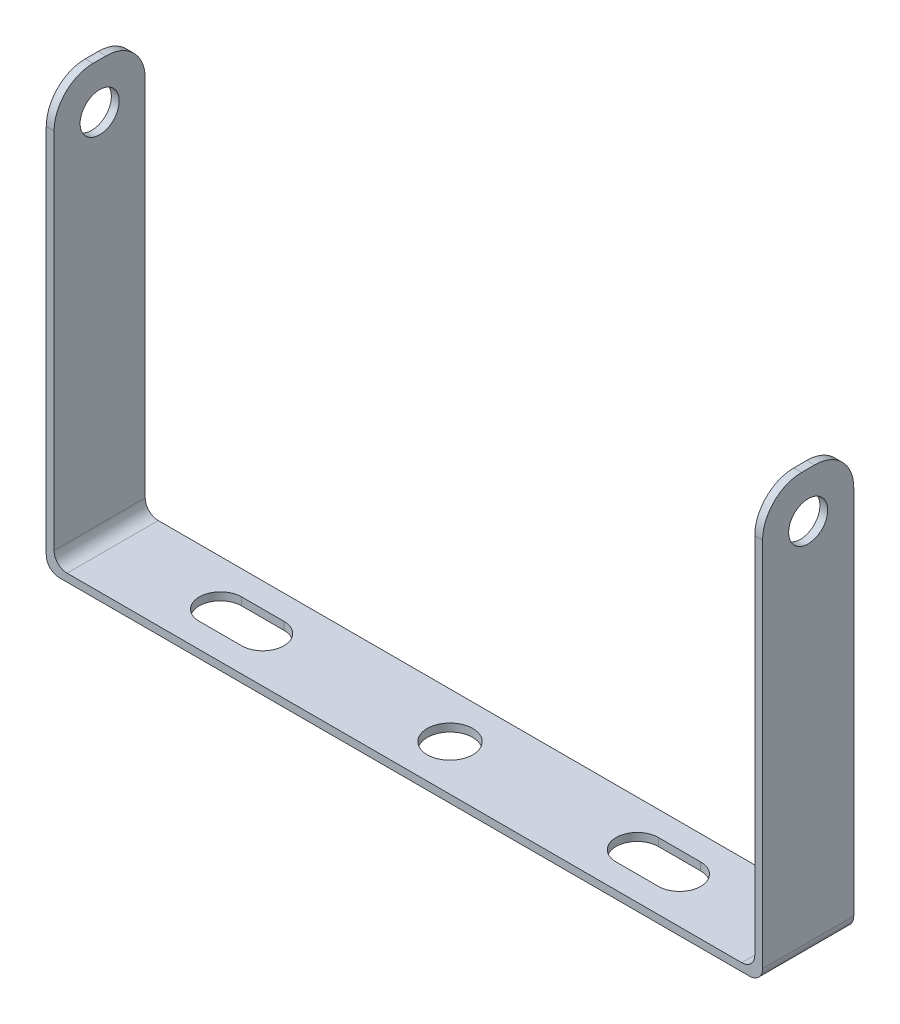
ISO-10303-21;
HEADER;
FILE_DESCRIPTION(('STEP AP214'),'2;1');
FILE_NAME('part.step','',(''),(''),'','','');
FILE_SCHEMA(('AUTOMOTIVE_DESIGN { 1 0 10303 214 1 1 1 1 }'));
ENDSEC;
DATA;
#1=APPLICATION_CONTEXT('core data for automotive mechanical design processes');
#2=APPLICATION_PROTOCOL_DEFINITION('international standard','automotive_design',2000,#1);
#3=PRODUCT_CONTEXT('',#1,'mechanical');
#4=PRODUCT('Part','Part','',(#3));
#5=PRODUCT_RELATED_PRODUCT_CATEGORY('part','',(#4));
#6=PRODUCT_DEFINITION_FORMATION('','',#4);
#7=PRODUCT_DEFINITION_CONTEXT('part definition',#1,'design');
#8=PRODUCT_DEFINITION('design','',#6,#7);
#9=PRODUCT_DEFINITION_SHAPE('','',#8);
#10=(LENGTH_UNIT() NAMED_UNIT(*) SI_UNIT(.MILLI.,.METRE.));
#11=(NAMED_UNIT(*) PLANE_ANGLE_UNIT() SI_UNIT($,.RADIAN.));
#12=(NAMED_UNIT(*) SI_UNIT($,.STERADIAN.) SOLID_ANGLE_UNIT());
#13=UNCERTAINTY_MEASURE_WITH_UNIT(LENGTH_MEASURE(1.E-05),#10,'distance_accuracy_value','');
#14=(GEOMETRIC_REPRESENTATION_CONTEXT(3) GLOBAL_UNCERTAINTY_ASSIGNED_CONTEXT((#13)) GLOBAL_UNIT_ASSIGNED_CONTEXT((#10,
#11,#12)) REPRESENTATION_CONTEXT('',''));
#15=CARTESIAN_POINT('',(0.,0.,0.));
#16=DIRECTION('',(0.,0.,1.));
#17=DIRECTION('',(1.,0.,0.));
#18=AXIS2_PLACEMENT_3D('',#15,#16,#17);
#19=CARTESIAN_POINT('',(0.,0.,14.));
#20=DIRECTION('',(-1.,0.,0.));
#21=DIRECTION('',(0.,0.,1.));
#22=AXIS2_PLACEMENT_3D('',#19,#20,#21);
#23=PLANE('',#22);
#24=CARTESIAN_POINT('',(0.,58.,7.00000000000001));
#25=DIRECTION('',(1.,0.,0.));
#26=DIRECTION('',(0.,0.,-1.));
#27=AXIS2_PLACEMENT_3D('',#24,#25,#26);
#28=CIRCLE('',#27,3.);
#29=CARTESIAN_POINT('',(0.,58.,4.00000000000001));
#30=VERTEX_POINT('',#29);
#31=EDGE_CURVE('E277',#30,#30,#28,.T.);
#32=ORIENTED_EDGE('',*,*,#31,.F.);
#33=EDGE_LOOP('',(#32));
#34=FACE_BOUND('',#33,.T.);
#35=DIRECTION('',(0.,1.,0.));
#36=VECTOR('',#35,1.);
#37=CARTESIAN_POINT('',(0.,0.,0.));
#38=LINE('',#37,#36);
#39=CARTESIAN_POINT('',(0.,2.,0.));
#40=VERTEX_POINT('',#39);
#41=CARTESIAN_POINT('',(0.,59.,0.));
#42=VERTEX_POINT('',#41);
#43=EDGE_CURVE('E289',#40,#42,#38,.T.);
#44=ORIENTED_EDGE('',*,*,#43,.T.);
#45=CARTESIAN_POINT('',(0.,59.,6.));
#46=DIRECTION('',(-1.,0.,0.));
#47=DIRECTION('',(0.,0.,1.));
#48=AXIS2_PLACEMENT_3D('',#45,#46,#47);
#49=CIRCLE('',#48,6.);
#50=CARTESIAN_POINT('',(0.,65.,6.));
#51=VERTEX_POINT('',#50);
#52=EDGE_CURVE('E388',#42,#51,#49,.F.);
#53=ORIENTED_EDGE('',*,*,#52,.T.);
#54=DIRECTION('',(0.,0.,-1.));
#55=VECTOR('',#54,1.);
#56=CARTESIAN_POINT('',(0.,65.,14.));
#57=LINE('',#56,#55);
#58=CARTESIAN_POINT('',(0.,65.,8.));
#59=VERTEX_POINT('',#58);
#60=EDGE_CURVE('E330',#59,#51,#57,.T.);
#61=ORIENTED_EDGE('',*,*,#60,.F.);
#62=CARTESIAN_POINT('',(0.,59.,8.));
#63=DIRECTION('',(-1.,0.,0.));
#64=DIRECTION('',(0.,0.,1.));
#65=AXIS2_PLACEMENT_3D('',#62,#63,#64);
#66=CIRCLE('',#65,6.);
#67=CARTESIAN_POINT('',(0.,59.,14.));
#68=VERTEX_POINT('',#67);
#69=EDGE_CURVE('E386',#59,#68,#66,.F.);
#70=ORIENTED_EDGE('',*,*,#69,.T.);
#71=DIRECTION('',(0.,1.,0.));
#72=VECTOR('',#71,1.);
#73=CARTESIAN_POINT('',(0.,0.,14.));
#74=LINE('',#73,#72);
#75=CARTESIAN_POINT('',(0.,2.,14.));
#76=VERTEX_POINT('',#75);
#77=EDGE_CURVE('E290',#76,#68,#74,.T.);
#78=ORIENTED_EDGE('',*,*,#77,.F.);
#79=DIRECTION('',(0.,0.,-1.));
#80=VECTOR('',#79,1.);
#81=CARTESIAN_POINT('',(0.,2.,14.));
#82=LINE('',#81,#80);
#83=EDGE_CURVE('E341',#76,#40,#82,.T.);
#84=ORIENTED_EDGE('',*,*,#83,.T.);
#85=EDGE_LOOP('',(#44,#53,#61,#70,#78,#84));
#86=FACE_BOUND('',#85,.T.);
#87=ADVANCED_FACE('F42',(#34,#86),#23,.F.);
#88=CARTESIAN_POINT('',(0.,65.,14.));
#89=DIRECTION('',(0.,-1.,0.));
#90=DIRECTION('',(0.,0.,-1.));
#91=AXIS2_PLACEMENT_3D('',#88,#89,#90);
#92=PLANE('',#91);
#93=ORIENTED_EDGE('',*,*,#60,.T.);
#94=DIRECTION('',(-1.,0.,0.));
#95=VECTOR('',#94,1.);
#96=CARTESIAN_POINT('',(0.,65.,6.));
#97=LINE('',#96,#95);
#98=CARTESIAN_POINT('',(-1.2,65.,6.));
#99=VERTEX_POINT('',#98);
#100=EDGE_CURVE('E375',#51,#99,#97,.T.);
#101=ORIENTED_EDGE('',*,*,#100,.T.);
#102=DIRECTION('',(0.,0.,-1.));
#103=VECTOR('',#102,1.);
#104=CARTESIAN_POINT('',(-1.2,65.,14.));
#105=LINE('',#104,#103);
#106=CARTESIAN_POINT('',(-1.2,65.,8.));
#107=VERTEX_POINT('',#106);
#108=EDGE_CURVE('E327',#107,#99,#105,.T.);
#109=ORIENTED_EDGE('',*,*,#108,.F.);
#110=DIRECTION('',(-1.,0.,0.));
#111=VECTOR('',#110,1.);
#112=CARTESIAN_POINT('',(0.,65.,8.));
#113=LINE('',#112,#111);
#114=EDGE_CURVE('E373',#107,#59,#113,.F.);
#115=ORIENTED_EDGE('',*,*,#114,.T.);
#116=EDGE_LOOP('',(#93,#101,#109,#115));
#117=FACE_BOUND('',#116,.T.);
#118=ADVANCED_FACE('F476',(#117),#92,.F.);
#119=CARTESIAN_POINT('',(-1.2,1.2,14.));
#120=DIRECTION('',(1.,0.,0.));
#121=DIRECTION('',(0.,0.,-1.));
#122=AXIS2_PLACEMENT_3D('',#119,#120,#121);
#123=PLANE('',#122);
#124=CARTESIAN_POINT('',(-1.20000000000001,58.,7.00000000000001));
#125=DIRECTION('',(1.,0.,0.));
#126=DIRECTION('',(0.,0.,-1.));
#127=AXIS2_PLACEMENT_3D('',#124,#125,#126);
#128=CIRCLE('',#127,3.);
#129=CARTESIAN_POINT('',(-1.20000000000001,58.,4.00000000000001));
#130=VERTEX_POINT('',#129);
#131=EDGE_CURVE('E286',#130,#130,#128,.T.);
#132=ORIENTED_EDGE('',*,*,#131,.T.);
#133=EDGE_LOOP('',(#132));
#134=FACE_BOUND('',#133,.T.);
#135=ORIENTED_EDGE('',*,*,#108,.T.);
#136=CARTESIAN_POINT('',(-1.2,59.,6.));
#137=DIRECTION('',(1.,0.,0.));
#138=DIRECTION('',(0.,0.,-1.));
#139=AXIS2_PLACEMENT_3D('',#136,#137,#138);
#140=CIRCLE('',#139,6.);
#141=CARTESIAN_POINT('',(-1.2,59.,0.));
#142=VERTEX_POINT('',#141);
#143=EDGE_CURVE('E380',#99,#142,#140,.F.);
#144=ORIENTED_EDGE('',*,*,#143,.T.);
#145=DIRECTION('',(0.,-1.,0.));
#146=VECTOR('',#145,1.);
#147=CARTESIAN_POINT('',(-1.2,1.2,0.));
#148=LINE('',#147,#146);
#149=CARTESIAN_POINT('',(-1.2,3.2,0.));
#150=VERTEX_POINT('',#149);
#151=EDGE_CURVE('E310',#142,#150,#148,.T.);
#152=ORIENTED_EDGE('',*,*,#151,.T.);
#153=DIRECTION('',(0.,0.,-1.));
#154=VECTOR('',#153,1.);
#155=CARTESIAN_POINT('',(-1.2,3.2,14.));
#156=LINE('',#155,#154);
#157=CARTESIAN_POINT('',(-1.2,3.2,14.));
#158=VERTEX_POINT('',#157);
#159=EDGE_CURVE('E338',#150,#158,#156,.F.);
#160=ORIENTED_EDGE('',*,*,#159,.T.);
#161=DIRECTION('',(0.,-1.,0.));
#162=VECTOR('',#161,1.);
#163=CARTESIAN_POINT('',(-1.2,1.2,14.));
#164=LINE('',#163,#162);
#165=CARTESIAN_POINT('',(-1.2,59.,14.));
#166=VERTEX_POINT('',#165);
#167=EDGE_CURVE('E293',#166,#158,#164,.T.);
#168=ORIENTED_EDGE('',*,*,#167,.F.);
#169=CARTESIAN_POINT('',(-1.2,59.,8.));
#170=DIRECTION('',(1.,0.,0.));
#171=DIRECTION('',(0.,0.,-1.));
#172=AXIS2_PLACEMENT_3D('',#169,#170,#171);
#173=CIRCLE('',#172,6.);
#174=EDGE_CURVE('E378',#166,#107,#173,.F.);
#175=ORIENTED_EDGE('',*,*,#174,.T.);
#176=EDGE_LOOP('',(#135,#144,#152,#160,#168,#175));
#177=FACE_BOUND('',#176,.T.);
#178=ADVANCED_FACE('F456',(#134,#177),#123,.F.);
#179=CARTESIAN_POINT('',(-1.2,1.2,14.));
#180=DIRECTION('',(0.,-1.,0.));
#181=DIRECTION('',(0.,0.,-1.));
#182=AXIS2_PLACEMENT_3D('',#179,#180,#181);
#183=PLANE('',#182);
#184=DIRECTION('',(1.,0.,0.));
#185=VECTOR('',#184,1.);
#186=CARTESIAN_POINT('',(-1.2,1.2,3.75));
#187=LINE('',#186,#185);
#188=CARTESIAN_POINT('',(-26.25,1.20000000000001,3.75));
#189=VERTEX_POINT('',#188);
#190=CARTESIAN_POINT('',(-19.75,1.20000000000001,3.75));
#191=VERTEX_POINT('',#190);
#192=EDGE_CURVE('E271',#189,#191,#187,.T.);
#193=ORIENTED_EDGE('',*,*,#192,.T.);
#194=CARTESIAN_POINT('',(-19.75,1.20000000000001,7.));
#195=DIRECTION('',(0.,-1.,0.));
#196=DIRECTION('',(0.,0.,-1.));
#197=AXIS2_PLACEMENT_3D('',#194,#195,#196);
#198=CIRCLE('',#197,3.25);
#199=CARTESIAN_POINT('',(-19.75,1.20000000000001,10.25));
#200=VERTEX_POINT('',#199);
#201=EDGE_CURVE('E274',#191,#200,#198,.T.);
#202=ORIENTED_EDGE('',*,*,#201,.T.);
#203=DIRECTION('',(-1.,0.,0.));
#204=VECTOR('',#203,1.);
#205=CARTESIAN_POINT('',(-1.2,1.2,10.25));
#206=LINE('',#205,#204);
#207=CARTESIAN_POINT('',(-26.25,1.2,10.25));
#208=VERTEX_POINT('',#207);
#209=EDGE_CURVE('E265',#200,#208,#206,.T.);
#210=ORIENTED_EDGE('',*,*,#209,.T.);
#211=CARTESIAN_POINT('',(-26.25,1.20000000000001,7.));
#212=DIRECTION('',(0.,-1.,0.));
#213=DIRECTION('',(0.,0.,-1.));
#214=AXIS2_PLACEMENT_3D('',#211,#212,#213);
#215=CIRCLE('',#214,3.25);
#216=EDGE_CURVE('E268',#208,#189,#215,.T.);
#217=ORIENTED_EDGE('',*,*,#216,.T.);
#218=EDGE_LOOP('',(#193,#202,#210,#217));
#219=FACE_BOUND('',#218,.T.);
#220=DIRECTION('',(-1.,0.,0.));
#221=VECTOR('',#220,1.);
#222=CARTESIAN_POINT('',(-1.2,1.2,10.25));
#223=LINE('',#222,#221);
#224=CARTESIAN_POINT('',(-83.75,1.20000000000001,10.25));
#225=VERTEX_POINT('',#224);
#226=CARTESIAN_POINT('',(-90.25,1.20000000000001,10.25));
#227=VERTEX_POINT('',#226);
#228=EDGE_CURVE('E262',#225,#227,#223,.T.);
#229=ORIENTED_EDGE('',*,*,#228,.T.);
#230=CARTESIAN_POINT('',(-90.25,1.20000000000001,7.));
#231=DIRECTION('',(0.,-1.,0.));
#232=DIRECTION('',(0.,0.,-1.));
#233=AXIS2_PLACEMENT_3D('',#230,#231,#232);
#234=CIRCLE('',#233,3.25);
#235=CARTESIAN_POINT('',(-90.25,1.20000000000001,3.75));
#236=VERTEX_POINT('',#235);
#237=EDGE_CURVE('E209',#227,#236,#234,.T.);
#238=ORIENTED_EDGE('',*,*,#237,.T.);
#239=DIRECTION('',(1.,0.,0.));
#240=VECTOR('',#239,1.);
#241=CARTESIAN_POINT('',(-1.2,1.2,3.75));
#242=LINE('',#241,#240);
#243=CARTESIAN_POINT('',(-83.75,1.2,3.75));
#244=VERTEX_POINT('',#243);
#245=EDGE_CURVE('E256',#236,#244,#242,.T.);
#246=ORIENTED_EDGE('',*,*,#245,.T.);
#247=CARTESIAN_POINT('',(-83.75,1.20000000000001,7.));
#248=DIRECTION('',(0.,-1.,0.));
#249=DIRECTION('',(0.,0.,-1.));
#250=AXIS2_PLACEMENT_3D('',#247,#248,#249);
#251=CIRCLE('',#250,3.25);
#252=EDGE_CURVE('E259',#244,#225,#251,.T.);
#253=ORIENTED_EDGE('',*,*,#252,.T.);
#254=EDGE_LOOP('',(#229,#238,#246,#253));
#255=FACE_BOUND('',#254,.T.);
#256=CARTESIAN_POINT('',(-55.,1.20000000000001,7.));
#257=DIRECTION('',(0.,-1.,0.));
#258=DIRECTION('',(0.,0.,-1.));
#259=AXIS2_PLACEMENT_3D('',#256,#257,#258);
#260=CIRCLE('',#259,3.5);
#261=CARTESIAN_POINT('',(-55.,1.20000000000001,3.5));
#262=VERTEX_POINT('',#261);
#263=EDGE_CURVE('E232',#262,#262,#260,.T.);
#264=ORIENTED_EDGE('',*,*,#263,.T.);
#265=EDGE_LOOP('',(#264));
#266=FACE_BOUND('',#265,.T.);
#267=DIRECTION('',(-1.,0.,0.));
#268=VECTOR('',#267,1.);
#269=CARTESIAN_POINT('',(-1.2,1.2,14.));
#270=LINE('',#269,#268);
#271=CARTESIAN_POINT('',(-3.2,1.2,14.));
#272=VERTEX_POINT('',#271);
#273=CARTESIAN_POINT('',(-106.8,1.2,14.));
#274=VERTEX_POINT('',#273);
#275=EDGE_CURVE('E296',#272,#274,#270,.T.);
#276=ORIENTED_EDGE('',*,*,#275,.F.);
#277=DIRECTION('',(0.,0.,-1.));
#278=VECTOR('',#277,1.);
#279=CARTESIAN_POINT('',(-3.2,1.2,0.));
#280=LINE('',#279,#278);
#281=CARTESIAN_POINT('',(-3.2,1.2,0.));
#282=VERTEX_POINT('',#281);
#283=EDGE_CURVE('E335',#272,#282,#280,.T.);
#284=ORIENTED_EDGE('',*,*,#283,.T.);
#285=DIRECTION('',(-1.,0.,0.));
#286=VECTOR('',#285,1.);
#287=CARTESIAN_POINT('',(-1.2,1.2,0.));
#288=LINE('',#287,#286);
#289=CARTESIAN_POINT('',(-106.8,1.2,0.));
#290=VERTEX_POINT('',#289);
#291=EDGE_CURVE('E312',#282,#290,#288,.T.);
#292=ORIENTED_EDGE('',*,*,#291,.T.);
#293=DIRECTION('',(0.,0.,-1.));
#294=VECTOR('',#293,1.);
#295=CARTESIAN_POINT('',(-106.8,1.2,14.));
#296=LINE('',#295,#294);
#297=EDGE_CURVE('E333',#290,#274,#296,.F.);
#298=ORIENTED_EDGE('',*,*,#297,.T.);
#299=EDGE_LOOP('',(#276,#284,#292,#298));
#300=FACE_BOUND('',#299,.T.);
#301=ADVANCED_FACE('F465',(#219,#255,#266,#300),#183,.F.);
#302=CARTESIAN_POINT('',(-108.8,1.2,14.));
#303=DIRECTION('',(-1.,0.,0.));
#304=DIRECTION('',(0.,0.,1.));
#305=AXIS2_PLACEMENT_3D('',#302,#303,#304);
#306=PLANE('',#305);
#307=CARTESIAN_POINT('',(-108.8,58.,7.00000000000001));
#308=DIRECTION('',(-1.,0.,0.));
#309=DIRECTION('',(0.,0.,1.));
#310=AXIS2_PLACEMENT_3D('',#307,#308,#309);
#311=CIRCLE('',#310,3.);
#312=CARTESIAN_POINT('',(-108.8,58.,10.));
#313=VERTEX_POINT('',#312);
#314=EDGE_CURVE('E281',#313,#313,#311,.T.);
#315=ORIENTED_EDGE('',*,*,#314,.T.);
#316=EDGE_LOOP('',(#315));
#317=FACE_BOUND('',#316,.T.);
#318=DIRECTION('',(0.,1.,0.));
#319=VECTOR('',#318,1.);
#320=CARTESIAN_POINT('',(-108.8,1.2,0.));
#321=LINE('',#320,#319);
#322=CARTESIAN_POINT('',(-108.8,3.2,0.));
#323=VERTEX_POINT('',#322);
#324=CARTESIAN_POINT('',(-108.8,59.,0.));
#325=VERTEX_POINT('',#324);
#326=EDGE_CURVE('E315',#323,#325,#321,.T.);
#327=ORIENTED_EDGE('',*,*,#326,.T.);
#328=CARTESIAN_POINT('',(-108.8,59.,6.));
#329=DIRECTION('',(-1.,0.,0.));
#330=DIRECTION('',(0.,0.,1.));
#331=AXIS2_PLACEMENT_3D('',#328,#329,#330);
#332=CIRCLE('',#331,6.);
#333=CARTESIAN_POINT('',(-108.8,65.,6.));
#334=VERTEX_POINT('',#333);
#335=EDGE_CURVE('E11',#325,#334,#332,.F.);
#336=ORIENTED_EDGE('',*,*,#335,.T.);
#337=DIRECTION('',(0.,0.,-1.));
#338=VECTOR('',#337,1.);
#339=CARTESIAN_POINT('',(-108.8,65.,14.));
#340=LINE('',#339,#338);
#341=CARTESIAN_POINT('',(-108.8,65.,8.));
#342=VERTEX_POINT('',#341);
#343=EDGE_CURVE('E324',#342,#334,#340,.T.);
#344=ORIENTED_EDGE('',*,*,#343,.F.);
#345=CARTESIAN_POINT('',(-108.8,59.,8.));
#346=DIRECTION('',(-1.,0.,0.));
#347=DIRECTION('',(0.,0.,1.));
#348=AXIS2_PLACEMENT_3D('',#345,#346,#347);
#349=CIRCLE('',#348,6.);
#350=CARTESIAN_POINT('',(-108.8,59.,14.));
#351=VERTEX_POINT('',#350);
#352=EDGE_CURVE('E50',#342,#351,#349,.F.);
#353=ORIENTED_EDGE('',*,*,#352,.T.);
#354=DIRECTION('',(0.,1.,0.));
#355=VECTOR('',#354,1.);
#356=CARTESIAN_POINT('',(-108.8,1.2,14.));
#357=LINE('',#356,#355);
#358=CARTESIAN_POINT('',(-108.8,3.2,14.));
#359=VERTEX_POINT('',#358);
#360=EDGE_CURVE('E299',#359,#351,#357,.T.);
#361=ORIENTED_EDGE('',*,*,#360,.F.);
#362=DIRECTION('',(0.,0.,-1.));
#363=VECTOR('',#362,1.);
#364=CARTESIAN_POINT('',(-108.8,3.2,0.));
#365=LINE('',#364,#363);
#366=EDGE_CURVE('E361',#359,#323,#365,.T.);
#367=ORIENTED_EDGE('',*,*,#366,.T.);
#368=EDGE_LOOP('',(#327,#336,#344,#353,#361,#367));
#369=FACE_BOUND('',#368,.T.);
#370=ADVANCED_FACE('F408',(#317,#369),#306,.F.);
#371=CARTESIAN_POINT('',(-110.,65.,14.));
#372=DIRECTION('',(0.,-1.,0.));
#373=DIRECTION('',(0.,0.,-1.));
#374=AXIS2_PLACEMENT_3D('',#371,#372,#373);
#375=PLANE('',#374);
#376=ORIENTED_EDGE('',*,*,#343,.T.);
#377=DIRECTION('',(-1.,0.,0.));
#378=VECTOR('',#377,1.);
#379=CARTESIAN_POINT('',(-110.,65.,6.));
#380=LINE('',#379,#378);
#381=CARTESIAN_POINT('',(-110.,65.,6.));
#382=VERTEX_POINT('',#381);
#383=EDGE_CURVE('E398',#334,#382,#380,.T.);
#384=ORIENTED_EDGE('',*,*,#383,.T.);
#385=DIRECTION('',(0.,0.,-1.));
#386=VECTOR('',#385,1.);
#387=CARTESIAN_POINT('',(-110.,65.,14.));
#388=LINE('',#387,#386);
#389=CARTESIAN_POINT('',(-110.,65.,8.));
#390=VERTEX_POINT('',#389);
#391=EDGE_CURVE('E307',#390,#382,#388,.T.);
#392=ORIENTED_EDGE('',*,*,#391,.F.);
#393=DIRECTION('',(-1.,0.,0.));
#394=VECTOR('',#393,1.);
#395=CARTESIAN_POINT('',(-108.8,65.,8.));
#396=LINE('',#395,#394);
#397=EDGE_CURVE('E396',#390,#342,#396,.F.);
#398=ORIENTED_EDGE('',*,*,#397,.T.);
#399=EDGE_LOOP('',(#376,#384,#392,#398));
#400=FACE_BOUND('',#399,.T.);
#401=ADVANCED_FACE('F421',(#400),#375,.F.);
#402=CARTESIAN_POINT('',(-110.,0.,14.));
#403=DIRECTION('',(1.,0.,0.));
#404=DIRECTION('',(0.,0.,-1.));
#405=AXIS2_PLACEMENT_3D('',#402,#403,#404);
#406=PLANE('',#405);
#407=CARTESIAN_POINT('',(-110.,58.,7.00000000000001));
#408=DIRECTION('',(1.,0.,0.));
#409=DIRECTION('',(0.,0.,-1.));
#410=AXIS2_PLACEMENT_3D('',#407,#408,#409);
#411=CIRCLE('',#410,3.);
#412=CARTESIAN_POINT('',(-110.,58.,4.00000000000001));
#413=VERTEX_POINT('',#412);
#414=EDGE_CURVE('E278',#413,#413,#411,.T.);
#415=ORIENTED_EDGE('',*,*,#414,.T.);
#416=EDGE_LOOP('',(#415));
#417=FACE_BOUND('',#416,.T.);
#418=ORIENTED_EDGE('',*,*,#391,.T.);
#419=CARTESIAN_POINT('',(-110.,59.,6.));
#420=DIRECTION('',(1.,0.,0.));
#421=DIRECTION('',(0.,0.,-1.));
#422=AXIS2_PLACEMENT_3D('',#419,#420,#421);
#423=CIRCLE('',#422,6.);
#424=CARTESIAN_POINT('',(-110.,59.,0.));
#425=VERTEX_POINT('',#424);
#426=EDGE_CURVE('E403',#382,#425,#423,.F.);
#427=ORIENTED_EDGE('',*,*,#426,.T.);
#428=DIRECTION('',(0.,-1.,0.));
#429=VECTOR('',#428,1.);
#430=CARTESIAN_POINT('',(-110.,0.,0.));
#431=LINE('',#430,#429);
#432=CARTESIAN_POINT('',(-110.,2.,0.));
#433=VERTEX_POINT('',#432);
#434=EDGE_CURVE('E318',#425,#433,#431,.T.);
#435=ORIENTED_EDGE('',*,*,#434,.T.);
#436=DIRECTION('',(0.,0.,-1.));
#437=VECTOR('',#436,1.);
#438=CARTESIAN_POINT('',(-110.,2.,14.));
#439=LINE('',#438,#437);
#440=CARTESIAN_POINT('',(-110.,2.,14.));
#441=VERTEX_POINT('',#440);
#442=EDGE_CURVE('E358',#433,#441,#439,.F.);
#443=ORIENTED_EDGE('',*,*,#442,.T.);
#444=DIRECTION('',(0.,-1.,0.));
#445=VECTOR('',#444,1.);
#446=CARTESIAN_POINT('',(-110.,0.,14.));
#447=LINE('',#446,#445);
#448=CARTESIAN_POINT('',(-110.,59.,14.));
#449=VERTEX_POINT('',#448);
#450=EDGE_CURVE('E302',#449,#441,#447,.T.);
#451=ORIENTED_EDGE('',*,*,#450,.F.);
#452=CARTESIAN_POINT('',(-110.,59.,8.));
#453=DIRECTION('',(1.,0.,0.));
#454=DIRECTION('',(0.,0.,-1.));
#455=AXIS2_PLACEMENT_3D('',#452,#453,#454);
#456=CIRCLE('',#455,6.);
#457=EDGE_CURVE('E401',#449,#390,#456,.F.);
#458=ORIENTED_EDGE('',*,*,#457,.T.);
#459=EDGE_LOOP('',(#418,#427,#435,#443,#451,#458));
#460=FACE_BOUND('',#459,.T.);
#461=ADVANCED_FACE('F419',(#417,#460),#406,.F.);
#462=CARTESIAN_POINT('',(0.,0.,14.));
#463=DIRECTION('',(0.,1.,0.));
#464=DIRECTION('',(0.,0.,1.));
#465=AXIS2_PLACEMENT_3D('',#462,#463,#464);
#466=PLANE('',#465);
#467=DIRECTION('',(-1.,0.,0.));
#468=VECTOR('',#467,1.);
#469=CARTESIAN_POINT('',(-19.75,0.,10.25));
#470=LINE('',#469,#468);
#471=CARTESIAN_POINT('',(-19.75,0.,10.25));
#472=VERTEX_POINT('',#471);
#473=CARTESIAN_POINT('',(-26.25,0.,10.25));
#474=VERTEX_POINT('',#473);
#475=EDGE_CURVE('E251',#472,#474,#470,.T.);
#476=ORIENTED_EDGE('',*,*,#475,.F.);
#477=CARTESIAN_POINT('',(-19.75,0.,7.));
#478=DIRECTION('',(0.,-1.,0.));
#479=DIRECTION('',(0.,0.,1.));
#480=AXIS2_PLACEMENT_3D('',#477,#478,#479);
#481=CIRCLE('',#480,3.25);
#482=CARTESIAN_POINT('',(-19.75,0.,3.75));
#483=VERTEX_POINT('',#482);
#484=EDGE_CURVE('E213',#483,#472,#481,.T.);
#485=ORIENTED_EDGE('',*,*,#484,.F.);
#486=DIRECTION('',(1.,0.,0.));
#487=VECTOR('',#486,1.);
#488=CARTESIAN_POINT('',(-19.75,0.,3.75));
#489=LINE('',#488,#487);
#490=CARTESIAN_POINT('',(-26.25,0.,3.75));
#491=VERTEX_POINT('',#490);
#492=EDGE_CURVE('E240',#491,#483,#489,.T.);
#493=ORIENTED_EDGE('',*,*,#492,.F.);
#494=CARTESIAN_POINT('',(-26.25,0.,7.));
#495=DIRECTION('',(0.,-1.,0.));
#496=DIRECTION('',(0.,0.,1.));
#497=AXIS2_PLACEMENT_3D('',#494,#495,#496);
#498=CIRCLE('',#497,3.25);
#499=EDGE_CURVE('E248',#474,#491,#498,.T.);
#500=ORIENTED_EDGE('',*,*,#499,.F.);
#501=EDGE_LOOP('',(#476,#485,#493,#500));
#502=FACE_BOUND('',#501,.T.);
#503=DIRECTION('',(1.,0.,0.));
#504=VECTOR('',#503,1.);
#505=CARTESIAN_POINT('',(-90.25,0.,3.75));
#506=LINE('',#505,#504);
#507=CARTESIAN_POINT('',(-90.25,0.,3.75));
#508=VERTEX_POINT('',#507);
#509=CARTESIAN_POINT('',(-83.75,0.,3.75));
#510=VERTEX_POINT('',#509);
#511=EDGE_CURVE('E228',#508,#510,#506,.T.);
#512=ORIENTED_EDGE('',*,*,#511,.F.);
#513=CARTESIAN_POINT('',(-90.25,0.,7.));
#514=DIRECTION('',(0.,-1.,0.));
#515=DIRECTION('',(0.,0.,-1.));
#516=AXIS2_PLACEMENT_3D('',#513,#514,#515);
#517=CIRCLE('',#516,3.25);
#518=CARTESIAN_POINT('',(-90.25,0.,10.25));
#519=VERTEX_POINT('',#518);
#520=EDGE_CURVE('E206',#519,#508,#517,.T.);
#521=ORIENTED_EDGE('',*,*,#520,.F.);
#522=DIRECTION('',(-1.,0.,0.));
#523=VECTOR('',#522,1.);
#524=CARTESIAN_POINT('',(-90.25,0.,10.25));
#525=LINE('',#524,#523);
#526=CARTESIAN_POINT('',(-83.75,0.,10.25));
#527=VERTEX_POINT('',#526);
#528=EDGE_CURVE('E216',#527,#519,#525,.T.);
#529=ORIENTED_EDGE('',*,*,#528,.F.);
#530=CARTESIAN_POINT('',(-83.75,0.,7.));
#531=DIRECTION('',(0.,-1.,0.));
#532=DIRECTION('',(0.,0.,-1.));
#533=AXIS2_PLACEMENT_3D('',#530,#531,#532);
#534=CIRCLE('',#533,3.25);
#535=EDGE_CURVE('E222',#510,#527,#534,.T.);
#536=ORIENTED_EDGE('',*,*,#535,.F.);
#537=EDGE_LOOP('',(#512,#521,#529,#536));
#538=FACE_BOUND('',#537,.T.);
#539=CARTESIAN_POINT('',(-55.,0.,7.));
#540=DIRECTION('',(0.,-1.,0.));
#541=DIRECTION('',(0.,0.,-1.));
#542=AXIS2_PLACEMENT_3D('',#539,#540,#541);
#543=CIRCLE('',#542,3.5);
#544=CARTESIAN_POINT('',(-55.,0.,3.5));
#545=VERTEX_POINT('',#544);
#546=EDGE_CURVE('E229',#545,#545,#543,.T.);
#547=ORIENTED_EDGE('',*,*,#546,.F.);
#548=EDGE_LOOP('',(#547));
#549=FACE_BOUND('',#548,.T.);
#550=DIRECTION('',(1.,0.,0.));
#551=VECTOR('',#550,1.);
#552=CARTESIAN_POINT('',(0.,0.,0.));
#553=LINE('',#552,#551);
#554=CARTESIAN_POINT('',(-108.,0.,0.));
#555=VERTEX_POINT('',#554);
#556=CARTESIAN_POINT('',(-2.,0.,0.));
#557=VERTEX_POINT('',#556);
#558=EDGE_CURVE('E294',#555,#557,#553,.T.);
#559=ORIENTED_EDGE('',*,*,#558,.T.);
#560=DIRECTION('',(0.,0.,-1.));
#561=VECTOR('',#560,1.);
#562=CARTESIAN_POINT('',(-2.,0.,14.));
#563=LINE('',#562,#561);
#564=CARTESIAN_POINT('',(-2.,0.,14.));
#565=VERTEX_POINT('',#564);
#566=EDGE_CURVE('E352',#557,#565,#563,.F.);
#567=ORIENTED_EDGE('',*,*,#566,.T.);
#568=DIRECTION('',(1.,0.,0.));
#569=VECTOR('',#568,1.);
#570=CARTESIAN_POINT('',(0.,0.,14.));
#571=LINE('',#570,#569);
#572=CARTESIAN_POINT('',(-108.,0.,14.));
#573=VERTEX_POINT('',#572);
#574=EDGE_CURVE('E304',#573,#565,#571,.T.);
#575=ORIENTED_EDGE('',*,*,#574,.F.);
#576=DIRECTION('',(0.,0.,-1.));
#577=VECTOR('',#576,1.);
#578=CARTESIAN_POINT('',(-108.,0.,14.));
#579=LINE('',#578,#577);
#580=EDGE_CURVE('E349',#573,#555,#579,.T.);
#581=ORIENTED_EDGE('',*,*,#580,.T.);
#582=EDGE_LOOP('',(#559,#567,#575,#581));
#583=FACE_BOUND('',#582,.T.);
#584=ADVANCED_FACE('F226',(#502,#538,#549,#583),#466,.F.);
#585=CARTESIAN_POINT('',(0.,0.,14.));
#586=DIRECTION('',(0.,0.,1.));
#587=DIRECTION('',(1.,0.,0.));
#588=AXIS2_PLACEMENT_3D('',#585,#586,#587);
#589=PLANE('',#588);
#590=ORIENTED_EDGE('',*,*,#77,.T.);
#591=DIRECTION('',(-1.,0.,0.));
#592=VECTOR('',#591,1.);
#593=CARTESIAN_POINT('',(-1.2,59.,14.));
#594=LINE('',#593,#592);
#595=EDGE_CURVE('E393',#68,#166,#594,.T.);
#596=ORIENTED_EDGE('',*,*,#595,.T.);
#597=ORIENTED_EDGE('',*,*,#167,.T.);
#598=CARTESIAN_POINT('',(-3.2,3.2,14.));
#599=DIRECTION('',(0.,0.,1.));
#600=DIRECTION('',(1.,0.,0.));
#601=AXIS2_PLACEMENT_3D('',#598,#599,#600);
#602=CIRCLE('',#601,2.);
#603=EDGE_CURVE('E367',#158,#272,#602,.F.);
#604=ORIENTED_EDGE('',*,*,#603,.T.);
#605=ORIENTED_EDGE('',*,*,#275,.T.);
#606=CARTESIAN_POINT('',(-106.8,3.2,14.));
#607=DIRECTION('',(0.,0.,1.));
#608=DIRECTION('',(1.,0.,0.));
#609=AXIS2_PLACEMENT_3D('',#606,#607,#608);
#610=CIRCLE('',#609,2.);
#611=EDGE_CURVE('E371',#274,#359,#610,.F.);
#612=ORIENTED_EDGE('',*,*,#611,.T.);
#613=ORIENTED_EDGE('',*,*,#360,.T.);
#614=DIRECTION('',(-1.,0.,0.));
#615=VECTOR('',#614,1.);
#616=CARTESIAN_POINT('',(-110.,59.,14.));
#617=LINE('',#616,#615);
#618=EDGE_CURVE('E390',#351,#449,#617,.T.);
#619=ORIENTED_EDGE('',*,*,#618,.T.);
#620=ORIENTED_EDGE('',*,*,#450,.T.);
#621=CARTESIAN_POINT('',(-108.,2.,14.));
#622=DIRECTION('',(0.,0.,1.));
#623=DIRECTION('',(1.,0.,0.));
#624=AXIS2_PLACEMENT_3D('',#621,#622,#623);
#625=CIRCLE('',#624,2.);
#626=EDGE_CURVE('E354',#441,#573,#625,.T.);
#627=ORIENTED_EDGE('',*,*,#626,.T.);
#628=ORIENTED_EDGE('',*,*,#574,.T.);
#629=CARTESIAN_POINT('',(-2.,2.,14.));
#630=DIRECTION('',(0.,0.,1.));
#631=DIRECTION('',(1.,0.,0.));
#632=AXIS2_PLACEMENT_3D('',#629,#630,#631);
#633=CIRCLE('',#632,2.);
#634=EDGE_CURVE('E356',#565,#76,#633,.T.);
#635=ORIENTED_EDGE('',*,*,#634,.T.);
#636=EDGE_LOOP('',(#590,#596,#597,#604,#605,#612,#613,#619,#620,#627,#628,#635));
#637=FACE_BOUND('',#636,.T.);
#638=ADVANCED_FACE('F414',(#637),#589,.T.);
#639=CARTESIAN_POINT('',(0.,0.,0.));
#640=DIRECTION('',(0.,0.,1.));
#641=DIRECTION('',(1.,0.,0.));
#642=AXIS2_PLACEMENT_3D('',#639,#640,#641);
#643=PLANE('',#642);
#644=ORIENTED_EDGE('',*,*,#151,.F.);
#645=DIRECTION('',(-1.,0.,0.));
#646=VECTOR('',#645,1.);
#647=CARTESIAN_POINT('',(0.,59.,0.));
#648=LINE('',#647,#646);
#649=EDGE_CURVE('E384',#142,#42,#648,.F.);
#650=ORIENTED_EDGE('',*,*,#649,.T.);
#651=ORIENTED_EDGE('',*,*,#43,.F.);
#652=CARTESIAN_POINT('',(-2.,2.,0.));
#653=DIRECTION('',(0.,0.,1.));
#654=DIRECTION('',(1.,0.,0.));
#655=AXIS2_PLACEMENT_3D('',#652,#653,#654);
#656=CIRCLE('',#655,2.);
#657=EDGE_CURVE('E347',#40,#557,#656,.F.);
#658=ORIENTED_EDGE('',*,*,#657,.T.);
#659=ORIENTED_EDGE('',*,*,#558,.F.);
#660=CARTESIAN_POINT('',(-108.,2.,0.));
#661=DIRECTION('',(0.,0.,1.));
#662=DIRECTION('',(1.,0.,0.));
#663=AXIS2_PLACEMENT_3D('',#660,#661,#662);
#664=CIRCLE('',#663,2.);
#665=EDGE_CURVE('E344',#555,#433,#664,.F.);
#666=ORIENTED_EDGE('',*,*,#665,.T.);
#667=ORIENTED_EDGE('',*,*,#434,.F.);
#668=DIRECTION('',(-1.,0.,0.));
#669=VECTOR('',#668,1.);
#670=CARTESIAN_POINT('',(0.,59.,0.));
#671=LINE('',#670,#669);
#672=EDGE_CURVE('E382',#425,#325,#671,.F.);
#673=ORIENTED_EDGE('',*,*,#672,.T.);
#674=ORIENTED_EDGE('',*,*,#326,.F.);
#675=CARTESIAN_POINT('',(-106.8,3.2,0.));
#676=DIRECTION('',(0.,0.,1.));
#677=DIRECTION('',(1.,0.,0.));
#678=AXIS2_PLACEMENT_3D('',#675,#676,#677);
#679=CIRCLE('',#678,2.);
#680=EDGE_CURVE('E369',#323,#290,#679,.T.);
#681=ORIENTED_EDGE('',*,*,#680,.T.);
#682=ORIENTED_EDGE('',*,*,#291,.F.);
#683=CARTESIAN_POINT('',(-3.2,3.2,0.));
#684=DIRECTION('',(0.,0.,1.));
#685=DIRECTION('',(1.,0.,0.));
#686=AXIS2_PLACEMENT_3D('',#683,#684,#685);
#687=CIRCLE('',#686,2.);
#688=EDGE_CURVE('E364',#282,#150,#687,.T.);
#689=ORIENTED_EDGE('',*,*,#688,.T.);
#690=EDGE_LOOP('',(#644,#650,#651,#658,#659,#666,#667,#673,#674,#681,#682,#689));
#691=FACE_BOUND('',#690,.T.);
#692=ADVANCED_FACE('F430',(#691),#643,.F.);
#693=CARTESIAN_POINT('',(-3.2,3.2,14.));
#694=DIRECTION('',(0.,0.,1.));
#695=DIRECTION('',(1.,0.,0.));
#696=AXIS2_PLACEMENT_3D('',#693,#694,#695);
#697=CYLINDRICAL_SURFACE('',#696,2.);
#698=ORIENTED_EDGE('',*,*,#603,.F.);
#699=ORIENTED_EDGE('',*,*,#159,.F.);
#700=ORIENTED_EDGE('',*,*,#688,.F.);
#701=ORIENTED_EDGE('',*,*,#283,.F.);
#702=EDGE_LOOP('',(#698,#699,#700,#701));
#703=FACE_BOUND('',#702,.T.);
#704=ADVANCED_FACE('F462',(#703),#697,.F.);
#705=CARTESIAN_POINT('',(-2.,2.,14.));
#706=DIRECTION('',(0.,0.,-1.));
#707=DIRECTION('',(-1.,0.,0.));
#708=AXIS2_PLACEMENT_3D('',#705,#706,#707);
#709=CYLINDRICAL_SURFACE('',#708,2.);
#710=ORIENTED_EDGE('',*,*,#634,.F.);
#711=ORIENTED_EDGE('',*,*,#566,.F.);
#712=ORIENTED_EDGE('',*,*,#657,.F.);
#713=ORIENTED_EDGE('',*,*,#83,.F.);
#714=EDGE_LOOP('',(#710,#711,#712,#713));
#715=FACE_BOUND('',#714,.T.);
#716=ADVANCED_FACE('F443',(#715),#709,.T.);
#717=CARTESIAN_POINT('',(-108.,2.,14.));
#718=DIRECTION('',(0.,0.,-1.));
#719=DIRECTION('',(-1.,0.,0.));
#720=AXIS2_PLACEMENT_3D('',#717,#718,#719);
#721=CYLINDRICAL_SURFACE('',#720,2.);
#722=ORIENTED_EDGE('',*,*,#626,.F.);
#723=ORIENTED_EDGE('',*,*,#442,.F.);
#724=ORIENTED_EDGE('',*,*,#665,.F.);
#725=ORIENTED_EDGE('',*,*,#580,.F.);
#726=EDGE_LOOP('',(#722,#723,#724,#725));
#727=FACE_BOUND('',#726,.T.);
#728=ADVANCED_FACE('F437',(#727),#721,.T.);
#729=CARTESIAN_POINT('',(-106.8,3.2,14.));
#730=DIRECTION('',(0.,0.,1.));
#731=DIRECTION('',(1.,0.,0.));
#732=AXIS2_PLACEMENT_3D('',#729,#730,#731);
#733=CYLINDRICAL_SURFACE('',#732,2.);
#734=ORIENTED_EDGE('',*,*,#611,.F.);
#735=ORIENTED_EDGE('',*,*,#297,.F.);
#736=ORIENTED_EDGE('',*,*,#680,.F.);
#737=ORIENTED_EDGE('',*,*,#366,.F.);
#738=EDGE_LOOP('',(#734,#735,#736,#737));
#739=FACE_BOUND('',#738,.T.);
#740=ADVANCED_FACE('F469',(#739),#733,.F.);
#741=CARTESIAN_POINT('',(-110.,58.,7.00000000000001));
#742=DIRECTION('',(1.,0.,0.));
#743=DIRECTION('',(0.,0.,-1.));
#744=AXIS2_PLACEMENT_3D('',#741,#742,#743);
#745=CYLINDRICAL_SURFACE('',#744,3.);
#746=ORIENTED_EDGE('',*,*,#414,.F.);
#747=EDGE_LOOP('',(#746));
#748=FACE_BOUND('',#747,.T.);
#749=ORIENTED_EDGE('',*,*,#314,.F.);
#750=EDGE_LOOP('',(#749));
#751=FACE_BOUND('',#750,.T.);
#752=ADVANCED_FACE('F497',(#748,#751),#745,.F.);
#753=ORIENTED_EDGE('',*,*,#31,.T.);
#754=EDGE_LOOP('',(#753));
#755=FACE_BOUND('',#754,.T.);
#756=ORIENTED_EDGE('',*,*,#131,.F.);
#757=EDGE_LOOP('',(#756));
#758=FACE_BOUND('',#757,.T.);
#759=ADVANCED_FACE('F500',(#755,#758),#745,.F.);
#760=CARTESIAN_POINT('',(0.,59.,6.));
#761=DIRECTION('',(-1.,0.,0.));
#762=DIRECTION('',(0.,0.,1.));
#763=AXIS2_PLACEMENT_3D('',#760,#761,#762);
#764=CYLINDRICAL_SURFACE('',#763,6.);
#765=ORIENTED_EDGE('',*,*,#52,.F.);
#766=ORIENTED_EDGE('',*,*,#649,.F.);
#767=ORIENTED_EDGE('',*,*,#143,.F.);
#768=ORIENTED_EDGE('',*,*,#100,.F.);
#769=EDGE_LOOP('',(#765,#766,#767,#768));
#770=FACE_BOUND('',#769,.T.);
#771=ADVANCED_FACE('F473',(#770),#764,.T.);
#772=CARTESIAN_POINT('',(0.,59.,8.));
#773=DIRECTION('',(1.,0.,0.));
#774=DIRECTION('',(0.,0.,-1.));
#775=AXIS2_PLACEMENT_3D('',#772,#773,#774);
#776=CYLINDRICAL_SURFACE('',#775,6.);
#777=ORIENTED_EDGE('',*,*,#69,.F.);
#778=ORIENTED_EDGE('',*,*,#114,.F.);
#779=ORIENTED_EDGE('',*,*,#174,.F.);
#780=ORIENTED_EDGE('',*,*,#595,.F.);
#781=EDGE_LOOP('',(#777,#778,#779,#780));
#782=FACE_BOUND('',#781,.T.);
#783=ADVANCED_FACE('F453',(#782),#776,.T.);
#784=CARTESIAN_POINT('',(-110.,59.,6.));
#785=DIRECTION('',(-1.,0.,0.));
#786=DIRECTION('',(0.,0.,1.));
#787=AXIS2_PLACEMENT_3D('',#784,#785,#786);
#788=CYLINDRICAL_SURFACE('',#787,6.);
#789=ORIENTED_EDGE('',*,*,#335,.F.);
#790=ORIENTED_EDGE('',*,*,#672,.F.);
#791=ORIENTED_EDGE('',*,*,#426,.F.);
#792=ORIENTED_EDGE('',*,*,#383,.F.);
#793=EDGE_LOOP('',(#789,#790,#791,#792));
#794=FACE_BOUND('',#793,.T.);
#795=ADVANCED_FACE('F425',(#794),#788,.T.);
#796=CARTESIAN_POINT('',(0.,59.,8.));
#797=DIRECTION('',(1.,0.,0.));
#798=DIRECTION('',(0.,0.,-1.));
#799=AXIS2_PLACEMENT_3D('',#796,#797,#798);
#800=CYLINDRICAL_SURFACE('',#799,6.);
#801=ORIENTED_EDGE('',*,*,#352,.F.);
#802=ORIENTED_EDGE('',*,*,#397,.F.);
#803=ORIENTED_EDGE('',*,*,#457,.F.);
#804=ORIENTED_EDGE('',*,*,#618,.F.);
#805=EDGE_LOOP('',(#801,#802,#803,#804));
#806=FACE_BOUND('',#805,.T.);
#807=ADVANCED_FACE('F44',(#806),#800,.T.);
#808=CARTESIAN_POINT('',(-55.,65.,7.));
#809=DIRECTION('',(0.,-1.,0.));
#810=DIRECTION('',(0.,0.,-1.));
#811=AXIS2_PLACEMENT_3D('',#808,#809,#810);
#812=CYLINDRICAL_SURFACE('',#811,3.5);
#813=ORIENTED_EDGE('',*,*,#546,.T.);
#814=EDGE_LOOP('',(#813));
#815=FACE_BOUND('',#814,.T.);
#816=ORIENTED_EDGE('',*,*,#263,.F.);
#817=EDGE_LOOP('',(#816));
#818=FACE_BOUND('',#817,.T.);
#819=ADVANCED_FACE('F506',(#815,#818),#812,.F.);
#820=CARTESIAN_POINT('',(-90.25,65.,7.));
#821=DIRECTION('',(0.,-1.,0.));
#822=DIRECTION('',(0.,0.,-1.));
#823=AXIS2_PLACEMENT_3D('',#820,#821,#822);
#824=CYLINDRICAL_SURFACE('',#823,3.25);
#825=DIRECTION('',(0.,-1.,0.));
#826=VECTOR('',#825,1.);
#827=CARTESIAN_POINT('',(-90.25,65.,10.25));
#828=LINE('',#827,#826);
#829=EDGE_CURVE('E201',#227,#519,#828,.T.);
#830=ORIENTED_EDGE('',*,*,#829,.T.);
#831=ORIENTED_EDGE('',*,*,#520,.T.);
#832=DIRECTION('',(0.,-1.,0.));
#833=VECTOR('',#832,1.);
#834=CARTESIAN_POINT('',(-90.25,65.,3.75));
#835=LINE('',#834,#833);
#836=EDGE_CURVE('E223',#236,#508,#835,.T.);
#837=ORIENTED_EDGE('',*,*,#836,.F.);
#838=ORIENTED_EDGE('',*,*,#237,.F.);
#839=EDGE_LOOP('',(#830,#831,#837,#838));
#840=FACE_BOUND('',#839,.T.);
#841=ADVANCED_FACE('F203',(#840),#824,.F.);
#842=CARTESIAN_POINT('',(-90.25,65.,10.25));
#843=DIRECTION('',(0.,0.,1.));
#844=DIRECTION('',(1.,0.,0.));
#845=AXIS2_PLACEMENT_3D('',#842,#843,#844);
#846=PLANE('',#845);
#847=DIRECTION('',(0.,-1.,0.));
#848=VECTOR('',#847,1.);
#849=CARTESIAN_POINT('',(-83.75,65.,10.25));
#850=LINE('',#849,#848);
#851=EDGE_CURVE('E212',#225,#527,#850,.T.);
#852=ORIENTED_EDGE('',*,*,#851,.T.);
#853=ORIENTED_EDGE('',*,*,#528,.T.);
#854=ORIENTED_EDGE('',*,*,#829,.F.);
#855=ORIENTED_EDGE('',*,*,#228,.F.);
#856=EDGE_LOOP('',(#852,#853,#854,#855));
#857=FACE_BOUND('',#856,.T.);
#858=ADVANCED_FACE('F217',(#857),#846,.F.);
#859=CARTESIAN_POINT('',(-83.75,65.,7.));
#860=DIRECTION('',(0.,-1.,0.));
#861=DIRECTION('',(0.,0.,-1.));
#862=AXIS2_PLACEMENT_3D('',#859,#860,#861);
#863=CYLINDRICAL_SURFACE('',#862,3.25);
#864=DIRECTION('',(0.,-1.,0.));
#865=VECTOR('',#864,1.);
#866=CARTESIAN_POINT('',(-83.75,65.,3.75));
#867=LINE('',#866,#865);
#868=EDGE_CURVE('E65',#244,#510,#867,.T.);
#869=ORIENTED_EDGE('',*,*,#868,.T.);
#870=ORIENTED_EDGE('',*,*,#535,.T.);
#871=ORIENTED_EDGE('',*,*,#851,.F.);
#872=ORIENTED_EDGE('',*,*,#252,.F.);
#873=EDGE_LOOP('',(#869,#870,#871,#872));
#874=FACE_BOUND('',#873,.T.);
#875=ADVANCED_FACE('F546',(#874),#863,.F.);
#876=CARTESIAN_POINT('',(-90.25,65.,3.75));
#877=DIRECTION('',(0.,0.,-1.));
#878=DIRECTION('',(-1.,0.,0.));
#879=AXIS2_PLACEMENT_3D('',#876,#877,#878);
#880=PLANE('',#879);
#881=ORIENTED_EDGE('',*,*,#836,.T.);
#882=ORIENTED_EDGE('',*,*,#511,.T.);
#883=ORIENTED_EDGE('',*,*,#868,.F.);
#884=ORIENTED_EDGE('',*,*,#245,.F.);
#885=EDGE_LOOP('',(#881,#882,#883,#884));
#886=FACE_BOUND('',#885,.T.);
#887=ADVANCED_FACE('F550',(#886),#880,.F.);
#888=CARTESIAN_POINT('',(-19.75,65.,7.));
#889=DIRECTION('',(0.,-1.,0.));
#890=DIRECTION('',(0.,0.,-1.));
#891=AXIS2_PLACEMENT_3D('',#888,#889,#890);
#892=CYLINDRICAL_SURFACE('',#891,3.25);
#893=DIRECTION('',(0.,-1.,0.));
#894=VECTOR('',#893,1.);
#895=CARTESIAN_POINT('',(-19.75,65.,3.75));
#896=LINE('',#895,#894);
#897=EDGE_CURVE('E244',#191,#483,#896,.T.);
#898=ORIENTED_EDGE('',*,*,#897,.T.);
#899=ORIENTED_EDGE('',*,*,#484,.T.);
#900=DIRECTION('',(0.,-1.,0.));
#901=VECTOR('',#900,1.);
#902=CARTESIAN_POINT('',(-19.75,65.,10.25));
#903=LINE('',#902,#901);
#904=EDGE_CURVE('E237',#200,#472,#903,.T.);
#905=ORIENTED_EDGE('',*,*,#904,.F.);
#906=ORIENTED_EDGE('',*,*,#201,.F.);
#907=EDGE_LOOP('',(#898,#899,#905,#906));
#908=FACE_BOUND('',#907,.T.);
#909=ADVANCED_FACE('F552',(#908),#892,.F.);
#910=CARTESIAN_POINT('',(-19.75,65.,3.75));
#911=DIRECTION('',(0.,0.,-1.));
#912=DIRECTION('',(-1.,0.,0.));
#913=AXIS2_PLACEMENT_3D('',#910,#911,#912);
#914=PLANE('',#913);
#915=DIRECTION('',(0.,-1.,0.));
#916=VECTOR('',#915,1.);
#917=CARTESIAN_POINT('',(-26.25,65.,3.75));
#918=LINE('',#917,#916);
#919=EDGE_CURVE('E242',#189,#491,#918,.T.);
#920=ORIENTED_EDGE('',*,*,#919,.T.);
#921=ORIENTED_EDGE('',*,*,#492,.T.);
#922=ORIENTED_EDGE('',*,*,#897,.F.);
#923=ORIENTED_EDGE('',*,*,#192,.F.);
#924=EDGE_LOOP('',(#920,#921,#922,#923));
#925=FACE_BOUND('',#924,.T.);
#926=ADVANCED_FACE('F521',(#925),#914,.F.);
#927=CARTESIAN_POINT('',(-26.25,65.,7.));
#928=DIRECTION('',(0.,-1.,0.));
#929=DIRECTION('',(0.,0.,-1.));
#930=AXIS2_PLACEMENT_3D('',#927,#928,#929);
#931=CYLINDRICAL_SURFACE('',#930,3.25);
#932=DIRECTION('',(0.,-1.,0.));
#933=VECTOR('',#932,1.);
#934=CARTESIAN_POINT('',(-26.25,65.,10.25));
#935=LINE('',#934,#933);
#936=EDGE_CURVE('E57',#208,#474,#935,.T.);
#937=ORIENTED_EDGE('',*,*,#936,.T.);
#938=ORIENTED_EDGE('',*,*,#499,.T.);
#939=ORIENTED_EDGE('',*,*,#919,.F.);
#940=ORIENTED_EDGE('',*,*,#216,.F.);
#941=EDGE_LOOP('',(#937,#938,#939,#940));
#942=FACE_BOUND('',#941,.T.);
#943=ADVANCED_FACE('F566',(#942),#931,.F.);
#944=CARTESIAN_POINT('',(-19.75,65.,10.25));
#945=DIRECTION('',(0.,0.,1.));
#946=DIRECTION('',(1.,0.,0.));
#947=AXIS2_PLACEMENT_3D('',#944,#945,#946);
#948=PLANE('',#947);
#949=ORIENTED_EDGE('',*,*,#904,.T.);
#950=ORIENTED_EDGE('',*,*,#475,.T.);
#951=ORIENTED_EDGE('',*,*,#936,.F.);
#952=ORIENTED_EDGE('',*,*,#209,.F.);
#953=EDGE_LOOP('',(#949,#950,#951,#952));
#954=FACE_BOUND('',#953,.T.);
#955=ADVANCED_FACE('F564',(#954),#948,.F.);
#956=CLOSED_SHELL('',(#87,#118,#178,#301,#370,#401,#461,#584,#638,#692,#704,#716,#728,#740,#752,
#759,#771,#783,#795,#807,#819,#841,#858,#875,#887,#909,#926,#943,#955));
#957=MANIFOLD_SOLID_BREP('B2',#956);
#958=ADVANCED_BREP_SHAPE_REPRESENTATION('',(#18,#957),#14);
#959=SHAPE_DEFINITION_REPRESENTATION(#9,#958);
ENDSEC;
END-ISO-10303-21;
